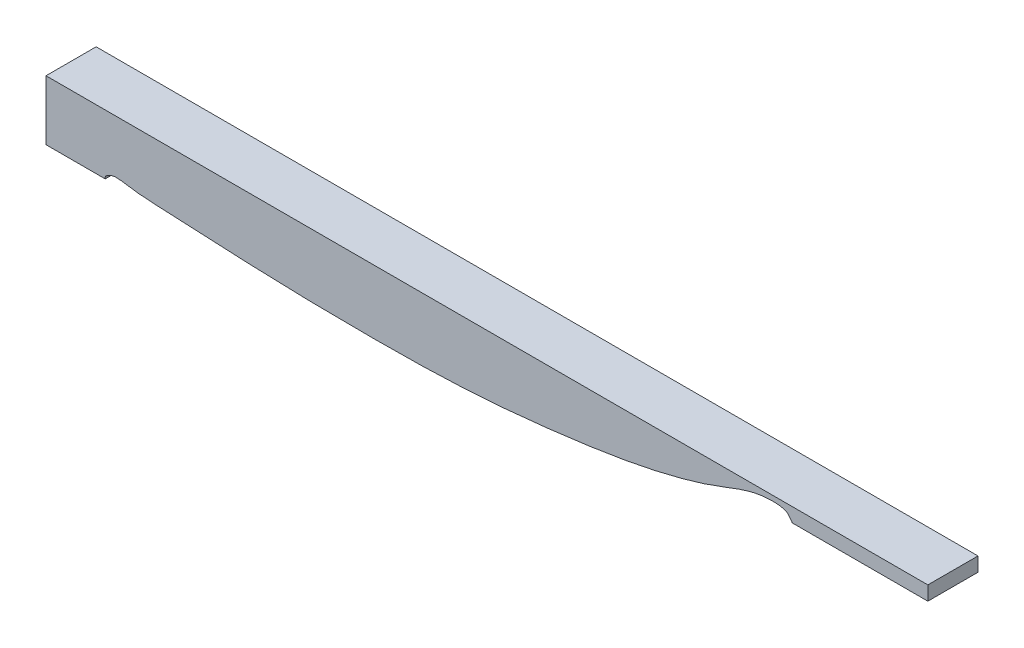
ISO-10303-21;
HEADER;
FILE_DESCRIPTION(('STEP AP214'),'2;1');
FILE_NAME('part.step','',(''),(''),'','','');
FILE_SCHEMA(('AUTOMOTIVE_DESIGN { 1 0 10303 214 1 1 1 1 }'));
ENDSEC;
DATA;
#1=APPLICATION_CONTEXT('core data for automotive mechanical design processes');
#2=APPLICATION_PROTOCOL_DEFINITION('international standard','automotive_design',2000,#1);
#3=PRODUCT_CONTEXT('',#1,'mechanical');
#4=PRODUCT('Part','Part','',(#3));
#5=PRODUCT_RELATED_PRODUCT_CATEGORY('part','',(#4));
#6=PRODUCT_DEFINITION_FORMATION('','',#4);
#7=PRODUCT_DEFINITION_CONTEXT('part definition',#1,'design');
#8=PRODUCT_DEFINITION('design','',#6,#7);
#9=PRODUCT_DEFINITION_SHAPE('','',#8);
#10=(LENGTH_UNIT() NAMED_UNIT(*) SI_UNIT(.MILLI.,.METRE.));
#11=(NAMED_UNIT(*) PLANE_ANGLE_UNIT() SI_UNIT($,.RADIAN.));
#12=(NAMED_UNIT(*) SI_UNIT($,.STERADIAN.) SOLID_ANGLE_UNIT());
#13=UNCERTAINTY_MEASURE_WITH_UNIT(LENGTH_MEASURE(1.E-05),#10,'distance_accuracy_value','');
#14=(GEOMETRIC_REPRESENTATION_CONTEXT(3) GLOBAL_UNCERTAINTY_ASSIGNED_CONTEXT((#13)) GLOBAL_UNIT_ASSIGNED_CONTEXT((#10,
#11,#12)) REPRESENTATION_CONTEXT('',''));
#15=CARTESIAN_POINT('',(0.,0.,0.));
#16=DIRECTION('',(0.,0.,1.));
#17=DIRECTION('',(1.,0.,0.));
#18=AXIS2_PLACEMENT_3D('',#15,#16,#17);
#19=CARTESIAN_POINT('',(-70.2681905662043,-7.27705406129944,484.));
#20=CARTESIAN_POINT('',(-70.2718567282212,-7.20177709688553,484.));
#21=CARTESIAN_POINT('',(-70.2745181211806,-7.12538441132618,484.));
#22=CARTESIAN_POINT('',(-70.2485295541686,-6.97700990042883,484.));
#23=CARTESIAN_POINT('',(-70.2201031967631,-6.90541941258138,484.));
#24=CARTESIAN_POINT('',(-70.1329235006198,-6.78152611832875,484.));
#25=CARTESIAN_POINT('',(-70.0746997726008,-6.73437724401592,484.));
#26=CARTESIAN_POINT('',(-69.950865537155,-6.65445891413178,484.));
#27=CARTESIAN_POINT('',(-69.8865462142957,-6.61762886315612,484.));
#28=CARTESIAN_POINT('',(-69.694667771333,-6.50642926338074,484.));
#29=CARTESIAN_POINT('',(-69.563005876487,-6.43815462471968,484.));
#30=CARTESIAN_POINT('',(-69.2914983140714,-6.32282834683386,484.));
#31=CARTESIAN_POINT('',(-69.1491698085736,-6.2777448843351,484.));
#32=CARTESIAN_POINT('',(-68.7186848582876,-6.19135934018556,484.));
#33=CARTESIAN_POINT('',(-68.4302700691104,-6.18935147931624,484.));
#34=CARTESIAN_POINT('',(-67.8524282271838,-6.22482428968812,484.));
#35=CARTESIAN_POINT('',(-67.5628235903301,-6.26226583559588,484.));
#36=CARTESIAN_POINT('',(-66.9873035087564,-6.35030007534889,484.));
#37=CARTESIAN_POINT('',(-66.7004778555158,-6.40098947209753,484.));
#38=CARTESIAN_POINT('',(-66.1251484221241,-6.49038509285349,484.));
#39=CARTESIAN_POINT('',(-65.8367554260219,-6.52988240386866,484.));
#40=CARTESIAN_POINT('',(-64.9696774949084,-6.63481436148011,484.));
#41=CARTESIAN_POINT('',(-64.3892361968003,-6.6858870300367,484.));
#42=CARTESIAN_POINT('',(-63.2279795221686,-6.76609087866197,484.));
#43=CARTESIAN_POINT('',(-62.6468579088273,-6.79779629774166,484.));
#44=CARTESIAN_POINT('',(-61.4845961075932,-6.86089096136395,484.));
#45=CARTESIAN_POINT('',(-60.903482695828,-6.89273598701872,484.));
#46=CARTESIAN_POINT('',(-59.1599437513892,-6.98488865276651,484.));
#47=CARTESIAN_POINT('',(-57.9973247860034,-7.04196810692361,484.));
#48=CARTESIAN_POINT('',(-54.5093979884235,-7.21156395222109,484.));
#49=CARTESIAN_POINT('',(-52.1839965865468,-7.32236787829454,484.));
#50=CARTESIAN_POINT('',(-47.5324466451927,-7.52729296790529,484.));
#51=CARTESIAN_POINT('',(-45.2062065150283,-7.62130351415046,484.));
#52=CARTESIAN_POINT('',(-40.5533235131358,-7.7721230695334,484.));
#53=CARTESIAN_POINT('',(-38.2266039555239,-7.82919401609615,484.));
#54=CARTESIAN_POINT('',(-33.5725741096259,-7.90437510944077,484.));
#55=CARTESIAN_POINT('',(-31.2452647614631,-7.92254726071419,484.));
#56=CARTESIAN_POINT('',(-26.5901937652624,-7.92906076956671,484.));
#57=CARTESIAN_POINT('',(-24.2620959998816,-7.9170873035077,484.));
#58=CARTESIAN_POINT('',(-19.6068961089026,-7.84531252469166,484.));
#59=CARTESIAN_POINT('',(-17.2800433504813,-7.78447371112376,484.));
#60=CARTESIAN_POINT('',(-12.6288245674146,-7.57975456484325,484.));
#61=CARTESIAN_POINT('',(-10.3047019593097,-7.4347911036251,484.));
#62=CARTESIAN_POINT('',(-5.6644908531239,-7.06369625381991,484.));
#63=CARTESIAN_POINT('',(-3.34716495540867,-6.83999379711669,484.));
#64=CARTESIAN_POINT('',(1.28107937082078,-6.33275355612075,484.));
#65=CARTESIAN_POINT('',(3.59131372657732,-6.04869237794813,484.));
#66=CARTESIAN_POINT('',(8.20272545977662,-5.40965498549012,484.));
#67=CARTESIAN_POINT('',(10.5046989870862,-5.05626922240079,484.));
#68=CARTESIAN_POINT('',(13.9403384193953,-4.441800842328,484.));
#69=CARTESIAN_POINT('',(15.0827515974078,-4.22237214017203,484.));
#70=CARTESIAN_POINT('',(17.3603119834693,-3.74561210019034,484.));
#71=CARTESIAN_POINT('',(18.4956728344272,-3.48762900853104,484.));
#72=CARTESIAN_POINT('',(20.7577201290484,-2.9340125520288,484.));
#73=CARTESIAN_POINT('',(21.8831388678125,-2.63941013738143,484.));
#74=CARTESIAN_POINT('',(24.1183282772558,-2.00052659559124,484.));
#75=CARTESIAN_POINT('',(25.2279003798933,-1.65561506445209,484.));
#76=CARTESIAN_POINT('',(26.8746524087493,-1.08235271269463,484.));
#77=CARTESIAN_POINT('',(27.4207635386564,-0.882356235748089,484.));
#78=CARTESIAN_POINT('',(28.510049863263,-0.473042419989765,484.));
#79=CARTESIAN_POINT('',(29.05274799074,-0.262210511758891,484.));
#80=CARTESIAN_POINT('',(30.684026587369,0.360176127211285,484.));
#81=CARTESIAN_POINT('',(31.7758807832345,0.759085438449735,484.));
#82=CARTESIAN_POINT('',(33.463819401538,1.16766938812841,484.));
#83=CARTESIAN_POINT('',(34.0351099439567,1.27120266805415,484.));
#84=CARTESIAN_POINT('',(35.1952360570956,1.41197788529778,484.));
#85=CARTESIAN_POINT('',(35.7814543315303,1.45030903946715,484.));
#86=CARTESIAN_POINT('',(36.6554730165947,1.44325775820052,484.));
#87=CARTESIAN_POINT('',(36.9466139276456,1.43034693244938,484.));
#88=CARTESIAN_POINT('',(37.3827061640913,1.37806732847471,484.));
#89=CARTESIAN_POINT('',(37.5282272431228,1.35538905811351,484.));
#90=CARTESIAN_POINT('',(37.8179432714584,1.297103357417,484.));
#91=CARTESIAN_POINT('',(37.9606259726876,1.26124350318554,484.));
#92=CARTESIAN_POINT('',(38.238267863478,1.16567487765699,484.));
#93=CARTESIAN_POINT('',(38.3752716582342,1.10415723404201,484.));
#94=CARTESIAN_POINT('',(38.6224501502022,0.944311958725488,484.));
#95=CARTESIAN_POINT('',(38.730176019571,0.84388281530465,484.));
#96=CARTESIAN_POINT('',(38.9270027005757,0.621721862889687,484.));
#97=CARTESIAN_POINT('',(39.0135122401266,0.501552643823061,484.));
#98=CARTESIAN_POINT('',(39.1490120868436,0.325677989968632,484.));
#99=CARTESIAN_POINT('',(39.1943971435455,0.2672198886547,484.));
#100=CARTESIAN_POINT('',(39.2740740468503,0.141833842278523,484.));
#101=CARTESIAN_POINT('',(39.3060065435813,0.0743193234377036,484.));
#102=CARTESIAN_POINT('',(39.3166186740201,0.,484.));
#103=B_SPLINE_CURVE_WITH_KNOTS('',3,(#19,#20,#21,#22,#23,#24,#25,#26,#27,#28,#29,#30,#31,#32,
#33,#34,#35,#36,#37,#38,#39,#40,#41,#42,#43,#44,#45,#46,#47,#48,#49,#50,#51,#52,#53,#54,#55,#56,
#57,#58,#59,#60,#61,#62,#63,#64,#65,#66,#67,#68,#69,#70,#71,#72,#73,#74,#75,#76,#77,#78,#79,#80,
#81,#82,#83,#84,#85,#86,#87,#88,#89,#90,#91,#92,#93,#94,#95,#96,#97,#98,#99,#100,#101,#102),
.UNSPECIFIED.,.F.,.F.,(4,2,2,2,2,2,2,2,2,2,2,2,2,2,2,2,2,2,2,2,2,2,2,2,2,2,2,2,2,2,2,2,2,2,2,2,
2,2,2,2,2,4),(0.,0.00195312500000022,0.00390625000000033,0.00585937500000056,
0.00781250000000067,0.0117187500000007,0.0156250000000007,0.0234375000000007,0.0312500000000007,
0.0390625000000007,0.0468750000000007,0.0625000000000004,0.0781250000000002,0.0937500000000001,
0.125,0.1875,0.249999999999999,0.312499999999999,0.374999999999999,0.437499999999999,
0.499999999999999,0.562499999999999,0.624999999999999,0.687499999999999,0.749999999999999,
0.781249999999999,0.812499999999999,0.843749999999999,0.874999999999999,0.890624999999999,
0.906249999999999,0.937499999999999,0.953124999999999,0.968749999999999,0.976562499999999,
0.980468749999999,0.984375,0.98828125,0.9921875,0.99609375,0.998046875,1.),.UNSPECIFIED.);
#104=DIRECTION('',(0.,0.,-1.));
#105=VECTOR('',#104,1.);
#106=SURFACE_OF_LINEAR_EXTRUSION('',#103,#105);
#107=CARTESIAN_POINT('',(-70.2681905662043,-7.27705406129944,476.));
#108=CARTESIAN_POINT('',(-70.2718567282212,-7.20177709688553,476.));
#109=CARTESIAN_POINT('',(-70.2745181211806,-7.12538441132618,476.));
#110=CARTESIAN_POINT('',(-70.2485295541686,-6.97700990042883,476.));
#111=CARTESIAN_POINT('',(-70.2201031967631,-6.90541941258138,476.));
#112=CARTESIAN_POINT('',(-70.1329235006198,-6.78152611832875,476.));
#113=CARTESIAN_POINT('',(-70.0746997726008,-6.73437724401592,476.));
#114=CARTESIAN_POINT('',(-69.950865537155,-6.65445891413178,476.));
#115=CARTESIAN_POINT('',(-69.8865462142957,-6.61762886315612,476.));
#116=CARTESIAN_POINT('',(-69.694667771333,-6.50642926338074,476.));
#117=CARTESIAN_POINT('',(-69.563005876487,-6.43815462471968,476.));
#118=CARTESIAN_POINT('',(-69.2914983140714,-6.32282834683386,476.));
#119=CARTESIAN_POINT('',(-69.1491698085736,-6.2777448843351,476.));
#120=CARTESIAN_POINT('',(-68.7186848582876,-6.19135934018556,476.));
#121=CARTESIAN_POINT('',(-68.4302700691104,-6.18935147931624,476.));
#122=CARTESIAN_POINT('',(-67.8524282271838,-6.22482428968812,476.));
#123=CARTESIAN_POINT('',(-67.5628235903301,-6.26226583559588,476.));
#124=CARTESIAN_POINT('',(-66.9873035087564,-6.35030007534889,476.));
#125=CARTESIAN_POINT('',(-66.7004778555158,-6.40098947209753,476.));
#126=CARTESIAN_POINT('',(-66.1251484221241,-6.49038509285349,476.));
#127=CARTESIAN_POINT('',(-65.8367554260219,-6.52988240386866,476.));
#128=CARTESIAN_POINT('',(-64.9696774949084,-6.63481436148011,476.));
#129=CARTESIAN_POINT('',(-64.3892361968003,-6.6858870300367,476.));
#130=CARTESIAN_POINT('',(-63.2279795221686,-6.76609087866197,476.));
#131=CARTESIAN_POINT('',(-62.6468579088273,-6.79779629774166,476.));
#132=CARTESIAN_POINT('',(-61.4845961075932,-6.86089096136395,476.));
#133=CARTESIAN_POINT('',(-60.903482695828,-6.89273598701872,476.));
#134=CARTESIAN_POINT('',(-59.1599437513892,-6.98488865276651,476.));
#135=CARTESIAN_POINT('',(-57.9973247860034,-7.04196810692361,476.));
#136=CARTESIAN_POINT('',(-54.5093979884235,-7.21156395222109,476.));
#137=CARTESIAN_POINT('',(-52.1839965865468,-7.32236787829454,476.));
#138=CARTESIAN_POINT('',(-47.5324466451927,-7.52729296790529,476.));
#139=CARTESIAN_POINT('',(-45.2062065150283,-7.62130351415046,476.));
#140=CARTESIAN_POINT('',(-40.5533235131358,-7.7721230695334,476.));
#141=CARTESIAN_POINT('',(-38.2266039555239,-7.82919401609615,476.));
#142=CARTESIAN_POINT('',(-33.5725741096259,-7.90437510944077,476.));
#143=CARTESIAN_POINT('',(-31.2452647614631,-7.92254726071419,476.));
#144=CARTESIAN_POINT('',(-26.5901937652624,-7.92906076956671,476.));
#145=CARTESIAN_POINT('',(-24.2620959998816,-7.9170873035077,476.));
#146=CARTESIAN_POINT('',(-19.6068961089026,-7.84531252469166,476.));
#147=CARTESIAN_POINT('',(-17.2800433504813,-7.78447371112376,476.));
#148=CARTESIAN_POINT('',(-12.6288245674146,-7.57975456484325,476.));
#149=CARTESIAN_POINT('',(-10.3047019593097,-7.4347911036251,476.));
#150=CARTESIAN_POINT('',(-5.6644908531239,-7.06369625381991,476.));
#151=CARTESIAN_POINT('',(-3.34716495540867,-6.83999379711669,476.));
#152=CARTESIAN_POINT('',(1.28107937082078,-6.33275355612075,476.));
#153=CARTESIAN_POINT('',(3.59131372657732,-6.04869237794813,476.));
#154=CARTESIAN_POINT('',(8.20272545977662,-5.40965498549012,476.));
#155=CARTESIAN_POINT('',(10.5046989870862,-5.05626922240079,476.));
#156=CARTESIAN_POINT('',(13.9403384193953,-4.441800842328,476.));
#157=CARTESIAN_POINT('',(15.0827515974078,-4.22237214017203,476.));
#158=CARTESIAN_POINT('',(17.3603119834693,-3.74561210019034,476.));
#159=CARTESIAN_POINT('',(18.4956728344272,-3.48762900853104,476.));
#160=CARTESIAN_POINT('',(20.7577201290484,-2.9340125520288,476.));
#161=CARTESIAN_POINT('',(21.8831388678125,-2.63941013738143,476.));
#162=CARTESIAN_POINT('',(24.1183282772558,-2.00052659559124,476.));
#163=CARTESIAN_POINT('',(25.2279003798933,-1.65561506445209,476.));
#164=CARTESIAN_POINT('',(26.8746524087493,-1.08235271269463,476.));
#165=CARTESIAN_POINT('',(27.4207635386564,-0.882356235748089,476.));
#166=CARTESIAN_POINT('',(28.510049863263,-0.473042419989765,476.));
#167=CARTESIAN_POINT('',(29.05274799074,-0.262210511758891,476.));
#168=CARTESIAN_POINT('',(30.684026587369,0.360176127211285,476.));
#169=CARTESIAN_POINT('',(31.7758807832345,0.759085438449735,476.));
#170=CARTESIAN_POINT('',(33.463819401538,1.16766938812841,476.));
#171=CARTESIAN_POINT('',(34.0351099439567,1.27120266805415,476.));
#172=CARTESIAN_POINT('',(35.1952360570956,1.41197788529778,476.));
#173=CARTESIAN_POINT('',(35.7814543315303,1.45030903946715,476.));
#174=CARTESIAN_POINT('',(36.6554730165947,1.44325775820052,476.));
#175=CARTESIAN_POINT('',(36.9466139276456,1.43034693244938,476.));
#176=CARTESIAN_POINT('',(37.3827061640913,1.37806732847471,476.));
#177=CARTESIAN_POINT('',(37.5282272431228,1.35538905811351,476.));
#178=CARTESIAN_POINT('',(37.8179432714584,1.297103357417,476.));
#179=CARTESIAN_POINT('',(37.9606259726876,1.26124350318554,476.));
#180=CARTESIAN_POINT('',(38.238267863478,1.16567487765699,476.));
#181=CARTESIAN_POINT('',(38.3752716582342,1.10415723404201,476.));
#182=CARTESIAN_POINT('',(38.6224501502022,0.944311958725488,476.));
#183=CARTESIAN_POINT('',(38.730176019571,0.84388281530465,476.));
#184=CARTESIAN_POINT('',(38.9270027005757,0.621721862889687,476.));
#185=CARTESIAN_POINT('',(39.0135122401266,0.501552643823061,476.));
#186=CARTESIAN_POINT('',(39.1490120868436,0.325677989968632,476.));
#187=CARTESIAN_POINT('',(39.1943971435455,0.2672198886547,476.));
#188=CARTESIAN_POINT('',(39.2740740468503,0.141833842278523,476.));
#189=CARTESIAN_POINT('',(39.3060065435813,0.0743193234377036,476.));
#190=CARTESIAN_POINT('',(39.3166186740201,0.,476.));
#191=B_SPLINE_CURVE_WITH_KNOTS('',3,(#107,#108,#109,#110,#111,#112,#113,#114,#115,#116,#117,
#118,#119,#120,#121,#122,#123,#124,#125,#126,#127,#128,#129,#130,#131,#132,#133,#134,#135,#136,
#137,#138,#139,#140,#141,#142,#143,#144,#145,#146,#147,#148,#149,#150,#151,#152,#153,#154,#155,
#156,#157,#158,#159,#160,#161,#162,#163,#164,#165,#166,#167,#168,#169,#170,#171,#172,#173,#174,
#175,#176,#177,#178,#179,#180,#181,#182,#183,#184,#185,#186,#187,#188,#189,#190),.UNSPECIFIED.,
.F.,.F.,(4,2,2,2,2,2,2,2,2,2,2,2,2,2,2,2,2,2,2,2,2,2,2,2,2,2,2,2,2,2,2,2,2,2,2,2,2,2,2,2,2,4),
(0.,0.00195312500000022,0.00390625000000033,0.00585937500000056,0.00781250000000067,
0.0117187500000007,0.0156250000000007,0.0234375000000007,0.0312500000000007,0.0390625000000007,
0.0468750000000007,0.0625000000000004,0.0781250000000002,0.0937500000000001,0.125,0.1875,
0.249999999999999,0.312499999999999,0.374999999999999,0.437499999999999,0.499999999999999,
0.562499999999999,0.624999999999999,0.687499999999999,0.749999999999999,0.781249999999999,
0.812499999999999,0.843749999999999,0.874999999999999,0.890624999999999,0.906249999999999,
0.937499999999999,0.953124999999999,0.968749999999999,0.976562499999999,0.980468749999999,
0.984375,0.98828125,0.9921875,0.99609375,0.998046875,1.),.UNSPECIFIED.);
#192=CARTESIAN_POINT('',(-70.2681905662043,-7.27705406129949,476.));
#193=VERTEX_POINT('',#192);
#194=CARTESIAN_POINT('',(39.31661867402,0.,476.));
#195=VERTEX_POINT('',#194);
#196=EDGE_CURVE('E165',#193,#195,#191,.T.);
#197=ORIENTED_EDGE('',*,*,#196,.T.);
#198=DIRECTION('',(0.,0.,-1.));
#199=VECTOR('',#198,1.);
#200=CARTESIAN_POINT('',(39.31661867402,0.,484.));
#201=LINE('',#200,#199);
#202=CARTESIAN_POINT('',(39.31661867402,0.,484.));
#203=VERTEX_POINT('',#202);
#204=EDGE_CURVE('E11',#203,#195,#201,.T.);
#205=ORIENTED_EDGE('',*,*,#204,.F.);
#206=CARTESIAN_POINT('',(39.3166186740201,0.,484.));
#207=CARTESIAN_POINT('',(39.3060065435813,0.0743193234377036,484.));
#208=CARTESIAN_POINT('',(39.2740740468503,0.141833842278523,484.));
#209=CARTESIAN_POINT('',(39.1943971435455,0.2672198886547,484.));
#210=CARTESIAN_POINT('',(39.1490120868436,0.325677989968632,484.));
#211=CARTESIAN_POINT('',(39.0135122401266,0.501552643823061,484.));
#212=CARTESIAN_POINT('',(38.9270027005757,0.621721862889687,484.));
#213=CARTESIAN_POINT('',(38.730176019571,0.84388281530465,484.));
#214=CARTESIAN_POINT('',(38.6224501502022,0.944311958725488,484.));
#215=CARTESIAN_POINT('',(38.3752716582342,1.10415723404201,484.));
#216=CARTESIAN_POINT('',(38.238267863478,1.16567487765699,484.));
#217=CARTESIAN_POINT('',(37.9606259726876,1.26124350318554,484.));
#218=CARTESIAN_POINT('',(37.8179432714584,1.297103357417,484.));
#219=CARTESIAN_POINT('',(37.5282272431228,1.35538905811351,484.));
#220=CARTESIAN_POINT('',(37.3827061640913,1.37806732847471,484.));
#221=CARTESIAN_POINT('',(36.9466139276456,1.43034693244938,484.));
#222=CARTESIAN_POINT('',(36.6554730165947,1.44325775820052,484.));
#223=CARTESIAN_POINT('',(35.7814543315303,1.45030903946715,484.));
#224=CARTESIAN_POINT('',(35.1952360570956,1.41197788529778,484.));
#225=CARTESIAN_POINT('',(34.0351099439567,1.27120266805415,484.));
#226=CARTESIAN_POINT('',(33.463819401538,1.16766938812841,484.));
#227=CARTESIAN_POINT('',(31.7758807832345,0.759085438449735,484.));
#228=CARTESIAN_POINT('',(30.684026587369,0.360176127211285,484.));
#229=CARTESIAN_POINT('',(29.05274799074,-0.262210511758891,484.));
#230=CARTESIAN_POINT('',(28.510049863263,-0.473042419989765,484.));
#231=CARTESIAN_POINT('',(27.4207635386564,-0.882356235748089,484.));
#232=CARTESIAN_POINT('',(26.8746524087493,-1.08235271269463,484.));
#233=CARTESIAN_POINT('',(25.2279003798933,-1.65561506445209,484.));
#234=CARTESIAN_POINT('',(24.1183282772558,-2.00052659559124,484.));
#235=CARTESIAN_POINT('',(21.8831388678125,-2.63941013738143,484.));
#236=CARTESIAN_POINT('',(20.7577201290484,-2.9340125520288,484.));
#237=CARTESIAN_POINT('',(18.4956728344272,-3.48762900853104,484.));
#238=CARTESIAN_POINT('',(17.3603119834693,-3.74561210019034,484.));
#239=CARTESIAN_POINT('',(15.0827515974078,-4.22237214017203,484.));
#240=CARTESIAN_POINT('',(13.9403384193953,-4.441800842328,484.));
#241=CARTESIAN_POINT('',(10.5046989870862,-5.05626922240079,484.));
#242=CARTESIAN_POINT('',(8.20272545977662,-5.40965498549012,484.));
#243=CARTESIAN_POINT('',(3.59131372657732,-6.04869237794813,484.));
#244=CARTESIAN_POINT('',(1.28107937082078,-6.33275355612075,484.));
#245=CARTESIAN_POINT('',(-3.34716495540867,-6.83999379711669,484.));
#246=CARTESIAN_POINT('',(-5.6644908531239,-7.06369625381991,484.));
#247=CARTESIAN_POINT('',(-10.3047019593097,-7.4347911036251,484.));
#248=CARTESIAN_POINT('',(-12.6288245674146,-7.57975456484325,484.));
#249=CARTESIAN_POINT('',(-17.2800433504813,-7.78447371112376,484.));
#250=CARTESIAN_POINT('',(-19.6068961089026,-7.84531252469166,484.));
#251=CARTESIAN_POINT('',(-24.2620959998816,-7.9170873035077,484.));
#252=CARTESIAN_POINT('',(-26.5901937652624,-7.92906076956671,484.));
#253=CARTESIAN_POINT('',(-31.2452647614631,-7.92254726071419,484.));
#254=CARTESIAN_POINT('',(-33.5725741096259,-7.90437510944077,484.));
#255=CARTESIAN_POINT('',(-38.2266039555239,-7.82919401609615,484.));
#256=CARTESIAN_POINT('',(-40.5533235131358,-7.7721230695334,484.));
#257=CARTESIAN_POINT('',(-45.2062065150283,-7.62130351415046,484.));
#258=CARTESIAN_POINT('',(-47.5324466451927,-7.52729296790529,484.));
#259=CARTESIAN_POINT('',(-52.1839965865468,-7.32236787829454,484.));
#260=CARTESIAN_POINT('',(-54.5093979884235,-7.21156395222109,484.));
#261=CARTESIAN_POINT('',(-57.9973247860034,-7.04196810692361,484.));
#262=CARTESIAN_POINT('',(-59.1599437513892,-6.98488865276651,484.));
#263=CARTESIAN_POINT('',(-60.903482695828,-6.89273598701872,484.));
#264=CARTESIAN_POINT('',(-61.4845961075932,-6.86089096136395,484.));
#265=CARTESIAN_POINT('',(-62.6468579088273,-6.79779629774166,484.));
#266=CARTESIAN_POINT('',(-63.2279795221686,-6.76609087866197,484.));
#267=CARTESIAN_POINT('',(-64.3892361968003,-6.6858870300367,484.));
#268=CARTESIAN_POINT('',(-64.9696774949084,-6.63481436148011,484.));
#269=CARTESIAN_POINT('',(-65.8367554260219,-6.52988240386866,484.));
#270=CARTESIAN_POINT('',(-66.1251484221241,-6.49038509285349,484.));
#271=CARTESIAN_POINT('',(-66.7004778555158,-6.40098947209753,484.));
#272=CARTESIAN_POINT('',(-66.9873035087564,-6.35030007534889,484.));
#273=CARTESIAN_POINT('',(-67.5628235903301,-6.26226583559588,484.));
#274=CARTESIAN_POINT('',(-67.8524282271838,-6.22482428968812,484.));
#275=CARTESIAN_POINT('',(-68.4302700691104,-6.18935147931624,484.));
#276=CARTESIAN_POINT('',(-68.7186848582876,-6.19135934018556,484.));
#277=CARTESIAN_POINT('',(-69.1491698085736,-6.2777448843351,484.));
#278=CARTESIAN_POINT('',(-69.2914983140714,-6.32282834683386,484.));
#279=CARTESIAN_POINT('',(-69.563005876487,-6.43815462471968,484.));
#280=CARTESIAN_POINT('',(-69.694667771333,-6.50642926338074,484.));
#281=CARTESIAN_POINT('',(-69.8865462142957,-6.61762886315612,484.));
#282=CARTESIAN_POINT('',(-69.950865537155,-6.65445891413178,484.));
#283=CARTESIAN_POINT('',(-70.0746997726008,-6.73437724401592,484.));
#284=CARTESIAN_POINT('',(-70.1329235006198,-6.78152611832875,484.));
#285=CARTESIAN_POINT('',(-70.2201031967631,-6.90541941258138,484.));
#286=CARTESIAN_POINT('',(-70.2485295541686,-6.97700990042883,484.));
#287=CARTESIAN_POINT('',(-70.2745181211806,-7.12538441132618,484.));
#288=CARTESIAN_POINT('',(-70.2718567282212,-7.20177709688553,484.));
#289=CARTESIAN_POINT('',(-70.2681905662043,-7.27705406129944,484.));
#290=B_SPLINE_CURVE_WITH_KNOTS('',3,(#206,#207,#208,#209,#210,#211,#212,#213,#214,#215,#216,
#217,#218,#219,#220,#221,#222,#223,#224,#225,#226,#227,#228,#229,#230,#231,#232,#233,#234,#235,
#236,#237,#238,#239,#240,#241,#242,#243,#244,#245,#246,#247,#248,#249,#250,#251,#252,#253,#254,
#255,#256,#257,#258,#259,#260,#261,#262,#263,#264,#265,#266,#267,#268,#269,#270,#271,#272,#273,
#274,#275,#276,#277,#278,#279,#280,#281,#282,#283,#284,#285,#286,#287,#288,#289),.UNSPECIFIED.,
.F.,.F.,(4,2,2,2,2,2,2,2,2,2,2,2,2,2,2,2,2,2,2,2,2,2,2,2,2,2,2,2,2,2,2,2,2,2,2,2,2,2,2,2,2,4),
(0.,0.00195312500000011,0.00390625000000011,0.00781250000000022,0.0117187500000003,
0.0156250000000004,0.0195312500000006,0.0234375000000007,0.0312500000000007,0.0468750000000008,
0.0625000000000009,0.0937500000000011,0.109375000000001,0.125000000000001,0.156250000000001,
0.187500000000001,0.218750000000001,0.250000000000001,0.312500000000001,0.375000000000001,
0.437500000000001,0.500000000000001,0.562500000000001,0.625000000000001,0.687500000000001,
0.750000000000001,0.8125,0.875,0.90625,0.921875,0.9375,0.953124999999999,0.960937499999999,
0.968749999999999,0.976562499999999,0.984374999999999,0.988281249999999,0.992187499999999,
0.994140624999999,0.99609375,0.998046875,1.),.UNSPECIFIED.);
#291=CARTESIAN_POINT('',(-70.2681905662043,-7.27705406129949,484.));
#292=VERTEX_POINT('',#291);
#293=EDGE_CURVE('E129',#292,#203,#290,.F.);
#294=ORIENTED_EDGE('',*,*,#293,.F.);
#295=DIRECTION('',(0.,0.,-1.));
#296=VECTOR('',#295,1.);
#297=CARTESIAN_POINT('',(-70.2681905662043,-7.27705406129949,484.));
#298=LINE('',#297,#296);
#299=EDGE_CURVE('E114',#292,#193,#298,.T.);
#300=ORIENTED_EDGE('',*,*,#299,.T.);
#301=EDGE_LOOP('',(#197,#205,#294,#300));
#302=FACE_BOUND('',#301,.T.);
#303=ADVANCED_FACE('F30',(#302),#106,.F.);
#304=CARTESIAN_POINT('',(39.31661867402,0.,484.));
#305=DIRECTION('',(0.,1.,0.));
#306=DIRECTION('',(-1.,0.,0.));
#307=AXIS2_PLACEMENT_3D('',#304,#305,#306);
#308=PLANE('',#307);
#309=DIRECTION('',(1.,0.,0.));
#310=VECTOR('',#309,1.);
#311=CARTESIAN_POINT('',(39.31661867402,0.,476.));
#312=LINE('',#311,#310);
#313=CARTESIAN_POINT('',(60.993585305782,0.,476.));
#314=VERTEX_POINT('',#313);
#315=EDGE_CURVE('E120',#195,#314,#312,.T.);
#316=ORIENTED_EDGE('',*,*,#315,.T.);
#317=DIRECTION('',(0.,0.,-1.));
#318=VECTOR('',#317,1.);
#319=CARTESIAN_POINT('',(60.993585305782,0.,484.));
#320=LINE('',#319,#318);
#321=CARTESIAN_POINT('',(60.993585305782,0.,484.));
#322=VERTEX_POINT('',#321);
#323=EDGE_CURVE('E41',#322,#314,#320,.T.);
#324=ORIENTED_EDGE('',*,*,#323,.F.);
#325=DIRECTION('',(1.,0.,0.));
#326=VECTOR('',#325,1.);
#327=CARTESIAN_POINT('',(39.31661867402,0.,484.));
#328=LINE('',#327,#326);
#329=EDGE_CURVE('E87',#203,#322,#328,.T.);
#330=ORIENTED_EDGE('',*,*,#329,.F.);
#331=ORIENTED_EDGE('',*,*,#204,.T.);
#332=EDGE_LOOP('',(#316,#324,#330,#331));
#333=FACE_BOUND('',#332,.T.);
#334=ADVANCED_FACE('F199',(#333),#308,.F.);
#335=CARTESIAN_POINT('',(60.9935853057819,2.25600000000005,484.));
#336=DIRECTION('',(-1.,0.,0.));
#337=DIRECTION('',(0.,-1.,0.));
#338=AXIS2_PLACEMENT_3D('',#335,#336,#337);
#339=PLANE('',#338);
#340=DIRECTION('',(0.,1.,0.));
#341=VECTOR('',#340,1.);
#342=CARTESIAN_POINT('',(60.9935853057819,2.25600000000005,476.));
#343=LINE('',#342,#341);
#344=CARTESIAN_POINT('',(60.9935853057819,2.25600000000005,476.));
#345=VERTEX_POINT('',#344);
#346=EDGE_CURVE('E118',#314,#345,#343,.T.);
#347=ORIENTED_EDGE('',*,*,#346,.T.);
#348=DIRECTION('',(0.,0.,-1.));
#349=VECTOR('',#348,1.);
#350=CARTESIAN_POINT('',(60.9935853057819,2.25600000000005,484.));
#351=LINE('',#350,#349);
#352=CARTESIAN_POINT('',(60.9935853057819,2.25600000000005,484.));
#353=VERTEX_POINT('',#352);
#354=EDGE_CURVE('E109',#353,#345,#351,.T.);
#355=ORIENTED_EDGE('',*,*,#354,.F.);
#356=DIRECTION('',(0.,1.,0.));
#357=VECTOR('',#356,1.);
#358=CARTESIAN_POINT('',(60.9935853057819,2.25600000000005,484.));
#359=LINE('',#358,#357);
#360=EDGE_CURVE('E100',#322,#353,#359,.T.);
#361=ORIENTED_EDGE('',*,*,#360,.F.);
#362=ORIENTED_EDGE('',*,*,#323,.T.);
#363=EDGE_LOOP('',(#347,#355,#361,#362));
#364=FACE_BOUND('',#363,.T.);
#365=ADVANCED_FACE('F202',(#364),#339,.F.);
#366=CARTESIAN_POINT('',(60.9935853057819,2.25600000000005,484.));
#367=DIRECTION('',(0.,-1.,0.));
#368=DIRECTION('',(1.,0.,0.));
#369=AXIS2_PLACEMENT_3D('',#366,#367,#368);
#370=PLANE('',#369);
#371=DIRECTION('',(-1.,0.,0.));
#372=VECTOR('',#371,1.);
#373=CARTESIAN_POINT('',(60.9935853057819,2.25600000000005,476.));
#374=LINE('',#373,#372);
#375=CARTESIAN_POINT('',(-79.7092097004089,2.25600000000003,476.));
#376=VERTEX_POINT('',#375);
#377=EDGE_CURVE('E108',#345,#376,#374,.T.);
#378=ORIENTED_EDGE('',*,*,#377,.T.);
#379=DIRECTION('',(0.,0.,-1.));
#380=VECTOR('',#379,1.);
#381=CARTESIAN_POINT('',(-79.7092097004089,2.25600000000003,484.));
#382=LINE('',#381,#380);
#383=CARTESIAN_POINT('',(-79.7092097004089,2.25600000000003,484.));
#384=VERTEX_POINT('',#383);
#385=EDGE_CURVE('E105',#384,#376,#382,.T.);
#386=ORIENTED_EDGE('',*,*,#385,.F.);
#387=DIRECTION('',(-1.,0.,0.));
#388=VECTOR('',#387,1.);
#389=CARTESIAN_POINT('',(60.9935853057819,2.25600000000005,484.));
#390=LINE('',#389,#388);
#391=EDGE_CURVE('E94',#353,#384,#390,.T.);
#392=ORIENTED_EDGE('',*,*,#391,.F.);
#393=ORIENTED_EDGE('',*,*,#354,.T.);
#394=EDGE_LOOP('',(#378,#386,#392,#393));
#395=FACE_BOUND('',#394,.T.);
#396=ADVANCED_FACE('F106',(#395),#370,.F.);
#397=CARTESIAN_POINT('',(-79.7092097004087,-7.27706261843527,484.));
#398=DIRECTION('',(1.,0.,0.));
#399=DIRECTION('',(0.,1.,0.));
#400=AXIS2_PLACEMENT_3D('',#397,#398,#399);
#401=PLANE('',#400);
#402=DIRECTION('',(0.,-1.,0.));
#403=VECTOR('',#402,1.);
#404=CARTESIAN_POINT('',(-79.7092097004087,-7.27706261843527,476.));
#405=LINE('',#404,#403);
#406=CARTESIAN_POINT('',(-79.7092097004087,-7.27706261843527,476.));
#407=VERTEX_POINT('',#406);
#408=EDGE_CURVE('E73',#376,#407,#405,.T.);
#409=ORIENTED_EDGE('',*,*,#408,.T.);
#410=DIRECTION('',(0.,0.,-1.));
#411=VECTOR('',#410,1.);
#412=CARTESIAN_POINT('',(-79.7092097004087,-7.27706261843527,484.));
#413=LINE('',#412,#411);
#414=CARTESIAN_POINT('',(-79.7092097004087,-7.27706261843527,484.));
#415=VERTEX_POINT('',#414);
#416=EDGE_CURVE('E110',#415,#407,#413,.T.);
#417=ORIENTED_EDGE('',*,*,#416,.F.);
#418=DIRECTION('',(0.,-1.,0.));
#419=VECTOR('',#418,1.);
#420=CARTESIAN_POINT('',(-79.7092097004087,-7.27706261843527,484.));
#421=LINE('',#420,#419);
#422=EDGE_CURVE('E98',#384,#415,#421,.T.);
#423=ORIENTED_EDGE('',*,*,#422,.F.);
#424=ORIENTED_EDGE('',*,*,#385,.T.);
#425=EDGE_LOOP('',(#409,#417,#423,#424));
#426=FACE_BOUND('',#425,.T.);
#427=ADVANCED_FACE('F112',(#426),#401,.F.);
#428=CARTESIAN_POINT('',(-79.7092097004087,-7.27706261843527,484.));
#429=DIRECTION('',(-9.06378396000871E-07,0.999999999999589,0.));
#430=DIRECTION('',(-0.999999999999589,-9.06378396000871E-07,0.));
#431=AXIS2_PLACEMENT_3D('',#428,#429,#430);
#432=PLANE('',#431);
#433=DIRECTION('',(0.999999999999589,9.06378396000871E-07,0.));
#434=VECTOR('',#433,1.);
#435=CARTESIAN_POINT('',(-79.7092097004087,-7.27706261843527,476.));
#436=LINE('',#435,#434);
#437=EDGE_CURVE('E79',#407,#193,#436,.T.);
#438=ORIENTED_EDGE('',*,*,#437,.T.);
#439=ORIENTED_EDGE('',*,*,#299,.F.);
#440=DIRECTION('',(0.999999999999589,9.06378396000871E-07,0.));
#441=VECTOR('',#440,1.);
#442=CARTESIAN_POINT('',(-79.7092097004087,-7.27706261843527,484.));
#443=LINE('',#442,#441);
#444=EDGE_CURVE('E50',#415,#292,#443,.T.);
#445=ORIENTED_EDGE('',*,*,#444,.F.);
#446=ORIENTED_EDGE('',*,*,#416,.T.);
#447=EDGE_LOOP('',(#438,#439,#445,#446));
#448=FACE_BOUND('',#447,.T.);
#449=ADVANCED_FACE('F145',(#448),#432,.F.);
#450=CARTESIAN_POINT('',(-14.9544339589478,-7.6821141379835,484.));
#451=DIRECTION('',(0.,0.,-1.));
#452=DIRECTION('',(-1.,0.,0.));
#453=AXIS2_PLACEMENT_3D('',#450,#451,#452);
#454=PLANE('',#453);
#455=ORIENTED_EDGE('',*,*,#293,.T.);
#456=ORIENTED_EDGE('',*,*,#329,.T.);
#457=ORIENTED_EDGE('',*,*,#360,.T.);
#458=ORIENTED_EDGE('',*,*,#391,.T.);
#459=ORIENTED_EDGE('',*,*,#422,.T.);
#460=ORIENTED_EDGE('',*,*,#444,.T.);
#461=EDGE_LOOP('',(#455,#456,#457,#458,#459,#460));
#462=FACE_BOUND('',#461,.T.);
#463=ADVANCED_FACE('F96',(#462),#454,.F.);
#464=CARTESIAN_POINT('',(-14.9544339589478,-7.6821141379835,476.));
#465=DIRECTION('',(0.,0.,-1.));
#466=DIRECTION('',(-1.,0.,0.));
#467=AXIS2_PLACEMENT_3D('',#464,#465,#466);
#468=PLANE('',#467);
#469=ORIENTED_EDGE('',*,*,#196,.F.);
#470=ORIENTED_EDGE('',*,*,#437,.F.);
#471=ORIENTED_EDGE('',*,*,#408,.F.);
#472=ORIENTED_EDGE('',*,*,#377,.F.);
#473=ORIENTED_EDGE('',*,*,#346,.F.);
#474=ORIENTED_EDGE('',*,*,#315,.F.);
#475=EDGE_LOOP('',(#469,#470,#471,#472,#473,#474));
#476=FACE_BOUND('',#475,.T.);
#477=ADVANCED_FACE('F144',(#476),#468,.T.);
#478=CLOSED_SHELL('',(#303,#334,#365,#396,#427,#449,#463,#477));
#479=MANIFOLD_SOLID_BREP('B2',#478);
#480=ADVANCED_BREP_SHAPE_REPRESENTATION('',(#18,#479),#14);
#481=SHAPE_DEFINITION_REPRESENTATION(#9,#480);
ENDSEC;
END-ISO-10303-21;
